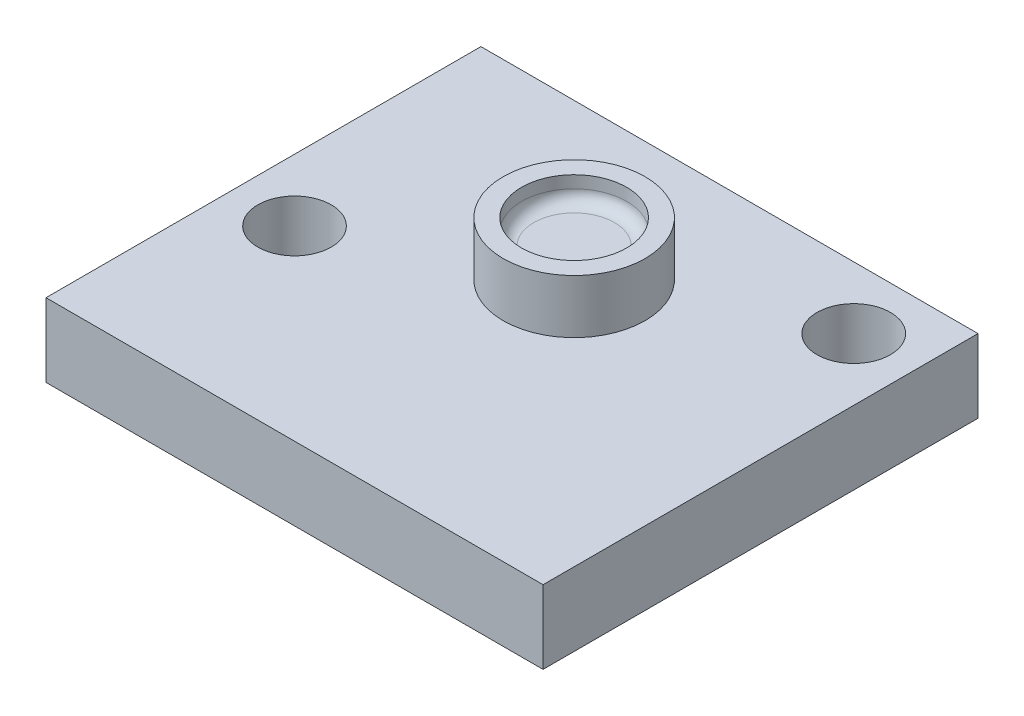
ISO-10303-21;
HEADER;
FILE_DESCRIPTION(('STEP AP214'),'2;1');
FILE_NAME('part.step','',(''),(''),'','','');
FILE_SCHEMA(('AUTOMOTIVE_DESIGN { 1 0 10303 214 1 1 1 1 }'));
ENDSEC;
DATA;
#1=APPLICATION_CONTEXT('core data for automotive mechanical design processes');
#2=APPLICATION_PROTOCOL_DEFINITION('international standard','automotive_design',2000,#1);
#3=PRODUCT_CONTEXT('',#1,'mechanical');
#4=PRODUCT('Part','Part','',(#3));
#5=PRODUCT_RELATED_PRODUCT_CATEGORY('part','',(#4));
#6=PRODUCT_DEFINITION_FORMATION('','',#4);
#7=PRODUCT_DEFINITION_CONTEXT('part definition',#1,'design');
#8=PRODUCT_DEFINITION('design','',#6,#7);
#9=PRODUCT_DEFINITION_SHAPE('','',#8);
#10=(LENGTH_UNIT() NAMED_UNIT(*) SI_UNIT(.MILLI.,.METRE.));
#11=(NAMED_UNIT(*) PLANE_ANGLE_UNIT() SI_UNIT($,.RADIAN.));
#12=(NAMED_UNIT(*) SI_UNIT($,.STERADIAN.) SOLID_ANGLE_UNIT());
#13=UNCERTAINTY_MEASURE_WITH_UNIT(LENGTH_MEASURE(1.E-05),#10,'distance_accuracy_value','');
#14=(GEOMETRIC_REPRESENTATION_CONTEXT(3) GLOBAL_UNCERTAINTY_ASSIGNED_CONTEXT((#13)) GLOBAL_UNIT_ASSIGNED_CONTEXT((#10,
#11,#12)) REPRESENTATION_CONTEXT('',''));
#15=CARTESIAN_POINT('',(0.,0.,0.));
#16=DIRECTION('',(0.,0.,1.));
#17=DIRECTION('',(1.,0.,0.));
#18=AXIS2_PLACEMENT_3D('',#15,#16,#17);
#19=CARTESIAN_POINT('',(7.62,3.,-6.35));
#20=DIRECTION('',(0.,-1.,0.));
#21=DIRECTION('',(0.,0.,-1.));
#22=AXIS2_PLACEMENT_3D('',#19,#20,#21);
#23=CYLINDRICAL_SURFACE('',#22,1.5);
#24=CARTESIAN_POINT('',(7.62,0.,-6.35));
#25=DIRECTION('',(0.,1.,0.));
#26=DIRECTION('',(0.,0.,1.));
#27=AXIS2_PLACEMENT_3D('',#24,#25,#26);
#28=CIRCLE('',#27,1.5);
#29=CARTESIAN_POINT('',(7.62,0.,-4.85));
#30=VERTEX_POINT('',#29);
#31=EDGE_CURVE('E185',#30,#30,#28,.T.);
#32=ORIENTED_EDGE('',*,*,#31,.F.);
#33=EDGE_LOOP('',(#32));
#34=FACE_BOUND('',#33,.T.);
#35=CARTESIAN_POINT('',(7.62,3.,-6.35));
#36=DIRECTION('',(0.,1.,0.));
#37=DIRECTION('',(0.,0.,1.));
#38=AXIS2_PLACEMENT_3D('',#35,#36,#37);
#39=CIRCLE('',#38,1.5);
#40=CARTESIAN_POINT('',(7.62,3.,-4.85));
#41=VERTEX_POINT('',#40);
#42=EDGE_CURVE('E240',#41,#41,#39,.T.);
#43=ORIENTED_EDGE('',*,*,#42,.T.);
#44=EDGE_LOOP('',(#43));
#45=FACE_BOUND('',#44,.T.);
#46=ADVANCED_FACE('F136',(#34,#45),#23,.F.);
#47=CARTESIAN_POINT('',(0.,0.,0.));
#48=DIRECTION('',(0.,1.,0.));
#49=DIRECTION('',(0.,0.,1.));
#50=AXIS2_PLACEMENT_3D('',#47,#48,#49);
#51=PLANE('',#50);
#52=ORIENTED_EDGE('',*,*,#31,.T.);
#53=EDGE_LOOP('',(#52));
#54=FACE_BOUND('',#53,.T.);
#55=CARTESIAN_POINT('',(-7.62,0.,1.27));
#56=DIRECTION('',(0.,1.,0.));
#57=DIRECTION('',(0.,0.,1.));
#58=AXIS2_PLACEMENT_3D('',#55,#56,#57);
#59=CIRCLE('',#58,1.5);
#60=CARTESIAN_POINT('',(-7.62,0.,2.77));
#61=VERTEX_POINT('',#60);
#62=EDGE_CURVE('E196',#61,#61,#59,.T.);
#63=ORIENTED_EDGE('',*,*,#62,.T.);
#64=EDGE_LOOP('',(#63));
#65=FACE_BOUND('',#64,.T.);
#66=DIRECTION('',(0.,0.,-1.));
#67=VECTOR('',#66,1.);
#68=CARTESIAN_POINT('',(-10.16,0.,0.));
#69=LINE('',#68,#67);
#70=CARTESIAN_POINT('',(-10.16,0.,8.89));
#71=VERTEX_POINT('',#70);
#72=CARTESIAN_POINT('',(-10.16,0.,-8.89));
#73=VERTEX_POINT('',#72);
#74=EDGE_CURVE('E178',#71,#73,#69,.T.);
#75=ORIENTED_EDGE('',*,*,#74,.T.);
#76=DIRECTION('',(1.,0.,0.));
#77=VECTOR('',#76,1.);
#78=CARTESIAN_POINT('',(-10.16,0.,-8.89));
#79=LINE('',#78,#77);
#80=CARTESIAN_POINT('',(10.16,0.,-8.89));
#81=VERTEX_POINT('',#80);
#82=EDGE_CURVE('E183',#73,#81,#79,.T.);
#83=ORIENTED_EDGE('',*,*,#82,.T.);
#84=DIRECTION('',(0.,0.,-1.));
#85=VECTOR('',#84,1.);
#86=CARTESIAN_POINT('',(10.16,0.,8.89));
#87=LINE('',#86,#85);
#88=CARTESIAN_POINT('',(10.16,0.,8.89));
#89=VERTEX_POINT('',#88);
#90=EDGE_CURVE('E204',#89,#81,#87,.T.);
#91=ORIENTED_EDGE('',*,*,#90,.F.);
#92=DIRECTION('',(1.,0.,0.));
#93=VECTOR('',#92,1.);
#94=CARTESIAN_POINT('',(0.,0.,8.89));
#95=LINE('',#94,#93);
#96=EDGE_CURVE('E173',#71,#89,#95,.T.);
#97=ORIENTED_EDGE('',*,*,#96,.F.);
#98=EDGE_LOOP('',(#75,#83,#91,#97));
#99=FACE_BOUND('',#98,.T.);
#100=ADVANCED_FACE('F180',(#54,#65,#99),#51,.F.);
#101=CARTESIAN_POINT('',(-7.62,3.,1.27));
#102=DIRECTION('',(0.,-1.,0.));
#103=DIRECTION('',(0.,0.,-1.));
#104=AXIS2_PLACEMENT_3D('',#101,#102,#103);
#105=CYLINDRICAL_SURFACE('',#104,1.5);
#106=CARTESIAN_POINT('',(-7.62,3.,1.27));
#107=DIRECTION('',(0.,1.,0.));
#108=DIRECTION('',(0.,0.,1.));
#109=AXIS2_PLACEMENT_3D('',#106,#107,#108);
#110=CIRCLE('',#109,1.5);
#111=CARTESIAN_POINT('',(-7.62,3.,2.77));
#112=VERTEX_POINT('',#111);
#113=EDGE_CURVE('E244',#112,#112,#110,.T.);
#114=ORIENTED_EDGE('',*,*,#113,.T.);
#115=EDGE_LOOP('',(#114));
#116=FACE_BOUND('',#115,.T.);
#117=ORIENTED_EDGE('',*,*,#62,.F.);
#118=EDGE_LOOP('',(#117));
#119=FACE_BOUND('',#118,.T.);
#120=ADVANCED_FACE('F260',(#116,#119),#105,.F.);
#121=CARTESIAN_POINT('',(0.,3.,8.89));
#122=DIRECTION('',(0.,0.,-1.));
#123=DIRECTION('',(-1.,0.,0.));
#124=AXIS2_PLACEMENT_3D('',#121,#122,#123);
#125=PLANE('',#124);
#126=ORIENTED_EDGE('',*,*,#96,.T.);
#127=DIRECTION('',(0.,-1.,0.));
#128=VECTOR('',#127,1.);
#129=CARTESIAN_POINT('',(10.16,3.,8.89));
#130=LINE('',#129,#128);
#131=CARTESIAN_POINT('',(10.16,3.,8.89));
#132=VERTEX_POINT('',#131);
#133=EDGE_CURVE('E197',#132,#89,#130,.T.);
#134=ORIENTED_EDGE('',*,*,#133,.F.);
#135=DIRECTION('',(1.,0.,0.));
#136=VECTOR('',#135,1.);
#137=CARTESIAN_POINT('',(0.,3.,8.89));
#138=LINE('',#137,#136);
#139=CARTESIAN_POINT('',(-10.16,3.,8.89));
#140=VERTEX_POINT('',#139);
#141=EDGE_CURVE('E226',#140,#132,#138,.T.);
#142=ORIENTED_EDGE('',*,*,#141,.F.);
#143=DIRECTION('',(0.,-1.,0.));
#144=VECTOR('',#143,1.);
#145=CARTESIAN_POINT('',(-10.16,3.,8.89));
#146=LINE('',#145,#144);
#147=EDGE_CURVE('E154',#140,#71,#146,.T.);
#148=ORIENTED_EDGE('',*,*,#147,.T.);
#149=EDGE_LOOP('',(#126,#134,#142,#148));
#150=FACE_BOUND('',#149,.T.);
#151=ADVANCED_FACE('F238',(#150),#125,.F.);
#152=CARTESIAN_POINT('',(-10.16,3.,0.));
#153=DIRECTION('',(-1.,0.,0.));
#154=DIRECTION('',(0.,0.,1.));
#155=AXIS2_PLACEMENT_3D('',#152,#153,#154);
#156=PLANE('',#155);
#157=ORIENTED_EDGE('',*,*,#74,.F.);
#158=ORIENTED_EDGE('',*,*,#147,.F.);
#159=DIRECTION('',(0.,0.,-1.));
#160=VECTOR('',#159,1.);
#161=CARTESIAN_POINT('',(-10.16,3.,0.));
#162=LINE('',#161,#160);
#163=CARTESIAN_POINT('',(-10.16,3.,-8.89));
#164=VERTEX_POINT('',#163);
#165=EDGE_CURVE('E191',#140,#164,#162,.T.);
#166=ORIENTED_EDGE('',*,*,#165,.T.);
#167=DIRECTION('',(0.,-1.,0.));
#168=VECTOR('',#167,1.);
#169=CARTESIAN_POINT('',(-10.16,3.,-8.89));
#170=LINE('',#169,#168);
#171=EDGE_CURVE('E188',#164,#73,#170,.T.);
#172=ORIENTED_EDGE('',*,*,#171,.T.);
#173=EDGE_LOOP('',(#157,#158,#166,#172));
#174=FACE_BOUND('',#173,.T.);
#175=ADVANCED_FACE('F189',(#174),#156,.T.);
#176=CARTESIAN_POINT('',(0.,3.,0.));
#177=DIRECTION('',(0.,1.,0.));
#178=DIRECTION('',(0.,0.,1.));
#179=AXIS2_PLACEMENT_3D('',#176,#177,#178);
#180=PLANE('',#179);
#181=CARTESIAN_POINT('',(0.,3.,-2.54));
#182=DIRECTION('',(0.,1.,0.));
#183=DIRECTION('',(0.,0.,1.));
#184=AXIS2_PLACEMENT_3D('',#181,#182,#183);
#185=CIRCLE('',#184,2.9);
#186=CARTESIAN_POINT('',(0.,3.,0.359999999999996));
#187=VERTEX_POINT('',#186);
#188=EDGE_CURVE('E212',#187,#187,#185,.T.);
#189=ORIENTED_EDGE('',*,*,#188,.F.);
#190=EDGE_LOOP('',(#189));
#191=FACE_BOUND('',#190,.T.);
#192=ORIENTED_EDGE('',*,*,#42,.F.);
#193=EDGE_LOOP('',(#192));
#194=FACE_BOUND('',#193,.T.);
#195=ORIENTED_EDGE('',*,*,#113,.F.);
#196=EDGE_LOOP('',(#195));
#197=FACE_BOUND('',#196,.T.);
#198=DIRECTION('',(1.,0.,0.));
#199=VECTOR('',#198,1.);
#200=CARTESIAN_POINT('',(-10.16,3.,-8.89));
#201=LINE('',#200,#199);
#202=CARTESIAN_POINT('',(10.16,3.,-8.89));
#203=VERTEX_POINT('',#202);
#204=EDGE_CURVE('E209',#164,#203,#201,.T.);
#205=ORIENTED_EDGE('',*,*,#204,.F.);
#206=ORIENTED_EDGE('',*,*,#165,.F.);
#207=ORIENTED_EDGE('',*,*,#141,.T.);
#208=DIRECTION('',(0.,0.,-1.));
#209=VECTOR('',#208,1.);
#210=CARTESIAN_POINT('',(10.16,3.,8.89));
#211=LINE('',#210,#209);
#212=EDGE_CURVE('E215',#132,#203,#211,.T.);
#213=ORIENTED_EDGE('',*,*,#212,.T.);
#214=EDGE_LOOP('',(#205,#206,#207,#213));
#215=FACE_BOUND('',#214,.T.);
#216=ADVANCED_FACE('F235',(#191,#194,#197,#215),#180,.T.);
#217=CARTESIAN_POINT('',(-10.16,3.,-8.89));
#218=DIRECTION('',(0.,0.,-1.));
#219=DIRECTION('',(-1.,0.,0.));
#220=AXIS2_PLACEMENT_3D('',#217,#218,#219);
#221=PLANE('',#220);
#222=ORIENTED_EDGE('',*,*,#82,.F.);
#223=ORIENTED_EDGE('',*,*,#171,.F.);
#224=ORIENTED_EDGE('',*,*,#204,.T.);
#225=DIRECTION('',(0.,-1.,0.));
#226=VECTOR('',#225,1.);
#227=CARTESIAN_POINT('',(10.16,3.,-8.89));
#228=LINE('',#227,#226);
#229=EDGE_CURVE('E201',#203,#81,#228,.T.);
#230=ORIENTED_EDGE('',*,*,#229,.T.);
#231=EDGE_LOOP('',(#222,#223,#224,#230));
#232=FACE_BOUND('',#231,.T.);
#233=ADVANCED_FACE('F199',(#232),#221,.T.);
#234=CARTESIAN_POINT('',(10.16,3.,8.89));
#235=DIRECTION('',(-1.,0.,0.));
#236=DIRECTION('',(0.,0.,1.));
#237=AXIS2_PLACEMENT_3D('',#234,#235,#236);
#238=PLANE('',#237);
#239=ORIENTED_EDGE('',*,*,#90,.T.);
#240=ORIENTED_EDGE('',*,*,#229,.F.);
#241=ORIENTED_EDGE('',*,*,#212,.F.);
#242=ORIENTED_EDGE('',*,*,#133,.T.);
#243=EDGE_LOOP('',(#239,#240,#241,#242));
#244=FACE_BOUND('',#243,.T.);
#245=ADVANCED_FACE('F237',(#244),#238,.F.);
#246=CARTESIAN_POINT('',(0.,5.2,-2.54));
#247=DIRECTION('',(0.,-1.,0.));
#248=DIRECTION('',(0.,0.,-1.));
#249=AXIS2_PLACEMENT_3D('',#246,#247,#248);
#250=CYLINDRICAL_SURFACE('',#249,2.9);
#251=CARTESIAN_POINT('',(0.,5.2,-2.54));
#252=DIRECTION('',(0.,1.,0.));
#253=DIRECTION('',(0.,0.,1.));
#254=AXIS2_PLACEMENT_3D('',#251,#252,#253);
#255=CIRCLE('',#254,2.9);
#256=CARTESIAN_POINT('',(0.,5.2,0.359999999999996));
#257=VERTEX_POINT('',#256);
#258=EDGE_CURVE('E205',#257,#257,#255,.T.);
#259=ORIENTED_EDGE('',*,*,#258,.F.);
#260=EDGE_LOOP('',(#259));
#261=FACE_BOUND('',#260,.T.);
#262=ORIENTED_EDGE('',*,*,#188,.T.);
#263=EDGE_LOOP('',(#262));
#264=FACE_BOUND('',#263,.T.);
#265=ADVANCED_FACE('F286',(#261,#264),#250,.T.);
#266=CARTESIAN_POINT('',(0.,5.2,-2.54));
#267=DIRECTION('',(0.,1.,0.));
#268=DIRECTION('',(0.,0.,1.));
#269=AXIS2_PLACEMENT_3D('',#266,#267,#268);
#270=PLANE('',#269);
#271=CARTESIAN_POINT('',(0.,5.2,-2.54));
#272=DIRECTION('',(0.,1.,0.));
#273=DIRECTION('',(0.,0.,1.));
#274=AXIS2_PLACEMENT_3D('',#271,#272,#273);
#275=CIRCLE('',#274,2.15);
#276=CARTESIAN_POINT('',(0.,5.2,-0.390000000000004));
#277=VERTEX_POINT('',#276);
#278=EDGE_CURVE('E275',#277,#277,#275,.T.);
#279=ORIENTED_EDGE('',*,*,#278,.F.);
#280=EDGE_LOOP('',(#279));
#281=FACE_BOUND('',#280,.T.);
#282=ORIENTED_EDGE('',*,*,#258,.T.);
#283=EDGE_LOOP('',(#282));
#284=FACE_BOUND('',#283,.T.);
#285=ADVANCED_FACE('F283',(#281,#284),#270,.T.);
#286=CARTESIAN_POINT('',(0.,4.2,-2.54));
#287=DIRECTION('',(0.,1.,0.));
#288=DIRECTION('',(0.,0.,1.));
#289=AXIS2_PLACEMENT_3D('',#286,#287,#288);
#290=CYLINDRICAL_SURFACE('',#289,2.15);
#291=CARTESIAN_POINT('',(0.,4.7,-2.54));
#292=DIRECTION('',(0.,1.,0.));
#293=DIRECTION('',(0.,0.,1.));
#294=AXIS2_PLACEMENT_3D('',#291,#292,#293);
#295=CIRCLE('',#294,2.15);
#296=CARTESIAN_POINT('',(0.,4.7,-0.390000000000004));
#297=VERTEX_POINT('',#296);
#298=EDGE_CURVE('E12',#297,#297,#295,.F.);
#299=ORIENTED_EDGE('',*,*,#298,.T.);
#300=EDGE_LOOP('',(#299));
#301=FACE_BOUND('',#300,.T.);
#302=ORIENTED_EDGE('',*,*,#278,.T.);
#303=EDGE_LOOP('',(#302));
#304=FACE_BOUND('',#303,.T.);
#305=ADVANCED_FACE('F281',(#301,#304),#290,.F.);
#306=CARTESIAN_POINT('',(0.,4.2,-2.54));
#307=DIRECTION('',(0.,1.,0.));
#308=DIRECTION('',(0.,0.,1.));
#309=AXIS2_PLACEMENT_3D('',#306,#307,#308);
#310=PLANE('',#309);
#311=CARTESIAN_POINT('',(0.,4.2,-2.54));
#312=DIRECTION('',(0.,1.,0.));
#313=DIRECTION('',(0.,0.,1.));
#314=AXIS2_PLACEMENT_3D('',#311,#312,#313);
#315=CIRCLE('',#314,1.65);
#316=CARTESIAN_POINT('',(0.,4.2,-0.890000000000004));
#317=VERTEX_POINT('',#316);
#318=EDGE_CURVE('E146',#317,#317,#315,.T.);
#319=ORIENTED_EDGE('',*,*,#318,.T.);
#320=EDGE_LOOP('',(#319));
#321=FACE_BOUND('',#320,.T.);
#322=ADVANCED_FACE('F328',(#321),#310,.T.);
#323=CARTESIAN_POINT('',(0.,4.7,-2.54));
#324=DIRECTION('',(0.,1.,0.));
#325=DIRECTION('',(0.,0.,1.));
#326=AXIS2_PLACEMENT_3D('',#323,#324,#325);
#327=TOROIDAL_SURFACE('',#326,1.65,0.5);
#328=ORIENTED_EDGE('',*,*,#298,.F.);
#329=EDGE_LOOP('',(#328));
#330=FACE_BOUND('',#329,.T.);
#331=ORIENTED_EDGE('',*,*,#318,.F.);
#332=EDGE_LOOP('',(#331));
#333=FACE_BOUND('',#332,.T.);
#334=ADVANCED_FACE('F138',(#330,#333),#327,.F.);
#335=CLOSED_SHELL('',(#46,#100,#120,#151,#175,#216,#233,#245,#265,#285,#305,#322,#334));
#336=MANIFOLD_SOLID_BREP('B2',#335);
#337=ADVANCED_BREP_SHAPE_REPRESENTATION('',(#18,#336),#14);
#338=SHAPE_DEFINITION_REPRESENTATION(#9,#337);
ENDSEC;
END-ISO-10303-21;
